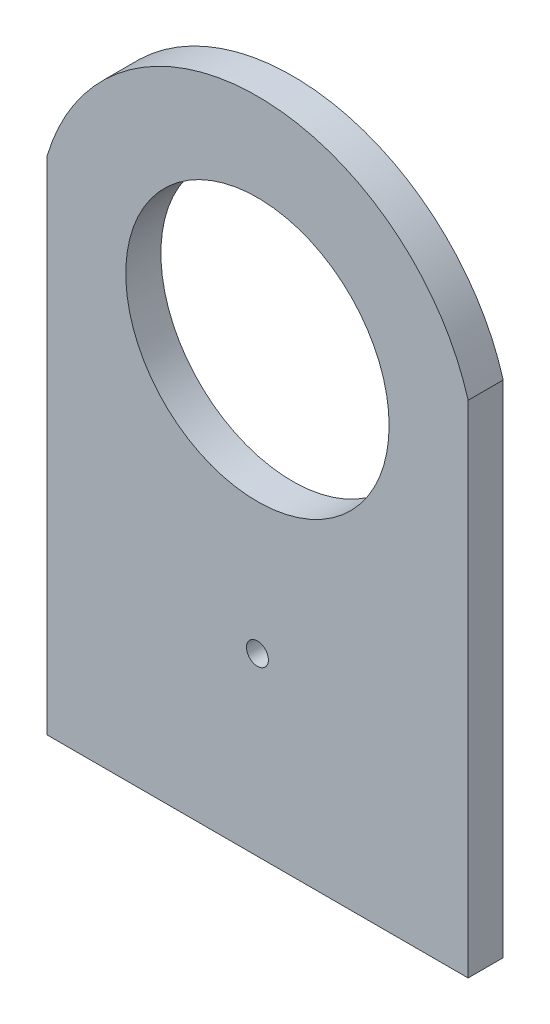
ISO-10303-21;
HEADER;
FILE_DESCRIPTION(('STEP AP214'),'2;1');
FILE_NAME('part.step','',(''),(''),'','','');
FILE_SCHEMA(('AUTOMOTIVE_DESIGN { 1 0 10303 214 1 1 1 1 }'));
ENDSEC;
DATA;
#1=APPLICATION_CONTEXT('core data for automotive mechanical design processes');
#2=APPLICATION_PROTOCOL_DEFINITION('international standard','automotive_design',2000,#1);
#3=PRODUCT_CONTEXT('',#1,'mechanical');
#4=PRODUCT('Part','Part','',(#3));
#5=PRODUCT_RELATED_PRODUCT_CATEGORY('part','',(#4));
#6=PRODUCT_DEFINITION_FORMATION('','',#4);
#7=PRODUCT_DEFINITION_CONTEXT('part definition',#1,'design');
#8=PRODUCT_DEFINITION('design','',#6,#7);
#9=PRODUCT_DEFINITION_SHAPE('','',#8);
#10=(LENGTH_UNIT() NAMED_UNIT(*) SI_UNIT(.MILLI.,.METRE.));
#11=(NAMED_UNIT(*) PLANE_ANGLE_UNIT() SI_UNIT($,.RADIAN.));
#12=(NAMED_UNIT(*) SI_UNIT($,.STERADIAN.) SOLID_ANGLE_UNIT());
#13=UNCERTAINTY_MEASURE_WITH_UNIT(LENGTH_MEASURE(1.E-05),#10,'distance_accuracy_value','');
#14=(GEOMETRIC_REPRESENTATION_CONTEXT(3) GLOBAL_UNCERTAINTY_ASSIGNED_CONTEXT((#13)) GLOBAL_UNIT_ASSIGNED_CONTEXT((#10,
#11,#12)) REPRESENTATION_CONTEXT('',''));
#15=CARTESIAN_POINT('',(0.,0.,0.));
#16=DIRECTION('',(0.,0.,1.));
#17=DIRECTION('',(1.,0.,0.));
#18=AXIS2_PLACEMENT_3D('',#15,#16,#17);
#19=CARTESIAN_POINT('',(0.,100.,8.));
#20=DIRECTION('',(0.,0.,1.));
#21=DIRECTION('',(1.,0.,0.));
#22=AXIS2_PLACEMENT_3D('',#19,#20,#21);
#23=PLANE('',#22);
#24=CARTESIAN_POINT('',(0.,40.,8.));
#25=DIRECTION('',(0.,0.,1.));
#26=DIRECTION('',(1.,0.,0.));
#27=AXIS2_PLACEMENT_3D('',#24,#25,#26);
#28=CIRCLE('',#27,2.5);
#29=CARTESIAN_POINT('',(2.5,40.,8.));
#30=VERTEX_POINT('',#29);
#31=EDGE_CURVE('E133',#30,#30,#28,.T.);
#32=ORIENTED_EDGE('',*,*,#31,.F.);
#33=EDGE_LOOP('',(#32));
#34=FACE_BOUND('',#33,.T.);
#35=DIRECTION('',(0.,1.,0.));
#36=VECTOR('',#35,1.);
#37=CARTESIAN_POINT('',(48.,114.,8.));
#38=LINE('',#37,#36);
#39=CARTESIAN_POINT('',(48.,0.,8.));
#40=VERTEX_POINT('',#39);
#41=CARTESIAN_POINT('',(48.,114.,8.));
#42=VERTEX_POINT('',#41);
#43=EDGE_CURVE('E88',#40,#42,#38,.T.);
#44=ORIENTED_EDGE('',*,*,#43,.T.);
#45=CARTESIAN_POINT('',(0.,100.,8.));
#46=DIRECTION('',(0.,0.,1.));
#47=DIRECTION('',(1.,0.,0.));
#48=AXIS2_PLACEMENT_3D('',#45,#46,#47);
#49=CIRCLE('',#48,50.);
#50=CARTESIAN_POINT('',(-48.,114.,8.));
#51=VERTEX_POINT('',#50);
#52=EDGE_CURVE('E83',#42,#51,#49,.T.);
#53=ORIENTED_EDGE('',*,*,#52,.T.);
#54=DIRECTION('',(0.,-1.,0.));
#55=VECTOR('',#54,1.);
#56=CARTESIAN_POINT('',(-48.,114.,8.));
#57=LINE('',#56,#55);
#58=CARTESIAN_POINT('',(-48.,0.,8.));
#59=VERTEX_POINT('',#58);
#60=EDGE_CURVE('E86',#51,#59,#57,.T.);
#61=ORIENTED_EDGE('',*,*,#60,.T.);
#62=DIRECTION('',(1.,0.,0.));
#63=VECTOR('',#62,1.);
#64=CARTESIAN_POINT('',(-48.,0.,8.));
#65=LINE('',#64,#63);
#66=EDGE_CURVE('E53',#59,#40,#65,.T.);
#67=ORIENTED_EDGE('',*,*,#66,.T.);
#68=EDGE_LOOP('',(#44,#53,#61,#67));
#69=FACE_BOUND('',#68,.T.);
#70=CARTESIAN_POINT('',(0.,100.,8.));
#71=DIRECTION('',(0.,0.,1.));
#72=DIRECTION('',(1.,0.,0.));
#73=AXIS2_PLACEMENT_3D('',#70,#71,#72);
#74=CIRCLE('',#73,30.);
#75=CARTESIAN_POINT('',(30.,100.,8.));
#76=VERTEX_POINT('',#75);
#77=EDGE_CURVE('E104',#76,#76,#74,.T.);
#78=ORIENTED_EDGE('',*,*,#77,.F.);
#79=EDGE_LOOP('',(#78));
#80=FACE_BOUND('',#79,.T.);
#81=ADVANCED_FACE('F35',(#34,#69,#80),#23,.T.);
#82=CARTESIAN_POINT('',(0.,100.,0.));
#83=DIRECTION('',(0.,0.,1.));
#84=DIRECTION('',(1.,0.,0.));
#85=AXIS2_PLACEMENT_3D('',#82,#83,#84);
#86=PLANE('',#85);
#87=CARTESIAN_POINT('',(0.,40.,0.));
#88=DIRECTION('',(0.,0.,1.));
#89=DIRECTION('',(1.,0.,0.));
#90=AXIS2_PLACEMENT_3D('',#87,#88,#89);
#91=CIRCLE('',#90,2.5);
#92=CARTESIAN_POINT('',(2.5,40.,0.));
#93=VERTEX_POINT('',#92);
#94=EDGE_CURVE('E39',#93,#93,#91,.T.);
#95=ORIENTED_EDGE('',*,*,#94,.T.);
#96=EDGE_LOOP('',(#95));
#97=FACE_BOUND('',#96,.T.);
#98=DIRECTION('',(0.,1.,0.));
#99=VECTOR('',#98,1.);
#100=CARTESIAN_POINT('',(48.,114.,0.));
#101=LINE('',#100,#99);
#102=CARTESIAN_POINT('',(48.,0.,0.));
#103=VERTEX_POINT('',#102);
#104=CARTESIAN_POINT('',(48.,114.,0.));
#105=VERTEX_POINT('',#104);
#106=EDGE_CURVE('E101',#103,#105,#101,.T.);
#107=ORIENTED_EDGE('',*,*,#106,.F.);
#108=DIRECTION('',(1.,0.,0.));
#109=VECTOR('',#108,1.);
#110=CARTESIAN_POINT('',(-48.,0.,0.));
#111=LINE('',#110,#109);
#112=CARTESIAN_POINT('',(-48.,0.,0.));
#113=VERTEX_POINT('',#112);
#114=EDGE_CURVE('E76',#113,#103,#111,.T.);
#115=ORIENTED_EDGE('',*,*,#114,.F.);
#116=DIRECTION('',(0.,-1.,0.));
#117=VECTOR('',#116,1.);
#118=CARTESIAN_POINT('',(-48.,114.,0.));
#119=LINE('',#118,#117);
#120=CARTESIAN_POINT('',(-48.,114.,0.));
#121=VERTEX_POINT('',#120);
#122=EDGE_CURVE('E70',#121,#113,#119,.T.);
#123=ORIENTED_EDGE('',*,*,#122,.F.);
#124=CARTESIAN_POINT('',(0.,100.,0.));
#125=DIRECTION('',(0.,0.,1.));
#126=DIRECTION('',(1.,0.,0.));
#127=AXIS2_PLACEMENT_3D('',#124,#125,#126);
#128=CIRCLE('',#127,50.);
#129=EDGE_CURVE('E92',#105,#121,#128,.T.);
#130=ORIENTED_EDGE('',*,*,#129,.F.);
#131=EDGE_LOOP('',(#107,#115,#123,#130));
#132=FACE_BOUND('',#131,.T.);
#133=CARTESIAN_POINT('',(0.,100.,0.));
#134=DIRECTION('',(0.,0.,1.));
#135=DIRECTION('',(1.,0.,0.));
#136=AXIS2_PLACEMENT_3D('',#133,#134,#135);
#137=CIRCLE('',#136,30.);
#138=CARTESIAN_POINT('',(30.,100.,0.));
#139=VERTEX_POINT('',#138);
#140=EDGE_CURVE('E116',#139,#139,#137,.T.);
#141=ORIENTED_EDGE('',*,*,#140,.T.);
#142=EDGE_LOOP('',(#141));
#143=FACE_BOUND('',#142,.T.);
#144=ADVANCED_FACE('F112',(#97,#132,#143),#86,.F.);
#145=CARTESIAN_POINT('',(48.,114.,8.));
#146=DIRECTION('',(-1.,0.,0.));
#147=DIRECTION('',(0.,-1.,0.));
#148=AXIS2_PLACEMENT_3D('',#145,#146,#147);
#149=PLANE('',#148);
#150=ORIENTED_EDGE('',*,*,#106,.T.);
#151=DIRECTION('',(0.,0.,-1.));
#152=VECTOR('',#151,1.);
#153=CARTESIAN_POINT('',(48.,114.,8.));
#154=LINE('',#153,#152);
#155=EDGE_CURVE('E11',#42,#105,#154,.T.);
#156=ORIENTED_EDGE('',*,*,#155,.F.);
#157=ORIENTED_EDGE('',*,*,#43,.F.);
#158=DIRECTION('',(0.,0.,-1.));
#159=VECTOR('',#158,1.);
#160=CARTESIAN_POINT('',(48.,0.,8.));
#161=LINE('',#160,#159);
#162=EDGE_CURVE('E97',#40,#103,#161,.T.);
#163=ORIENTED_EDGE('',*,*,#162,.T.);
#164=EDGE_LOOP('',(#150,#156,#157,#163));
#165=FACE_BOUND('',#164,.T.);
#166=ADVANCED_FACE('F37',(#165),#149,.F.);
#167=CARTESIAN_POINT('',(0.,100.,8.));
#168=DIRECTION('',(0.,0.,-1.));
#169=DIRECTION('',(-1.,0.,0.));
#170=AXIS2_PLACEMENT_3D('',#167,#168,#169);
#171=CYLINDRICAL_SURFACE('',#170,50.);
#172=ORIENTED_EDGE('',*,*,#129,.T.);
#173=DIRECTION('',(0.,0.,-1.));
#174=VECTOR('',#173,1.);
#175=CARTESIAN_POINT('',(-48.,114.,8.));
#176=LINE('',#175,#174);
#177=EDGE_CURVE('E45',#51,#121,#176,.T.);
#178=ORIENTED_EDGE('',*,*,#177,.F.);
#179=ORIENTED_EDGE('',*,*,#52,.F.);
#180=ORIENTED_EDGE('',*,*,#155,.T.);
#181=EDGE_LOOP('',(#172,#178,#179,#180));
#182=FACE_BOUND('',#181,.T.);
#183=ADVANCED_FACE('F91',(#182),#171,.T.);
#184=CARTESIAN_POINT('',(-48.,114.,8.));
#185=DIRECTION('',(1.,0.,0.));
#186=DIRECTION('',(0.,1.,0.));
#187=AXIS2_PLACEMENT_3D('',#184,#185,#186);
#188=PLANE('',#187);
#189=ORIENTED_EDGE('',*,*,#122,.T.);
#190=DIRECTION('',(0.,0.,-1.));
#191=VECTOR('',#190,1.);
#192=CARTESIAN_POINT('',(-48.,0.,8.));
#193=LINE('',#192,#191);
#194=EDGE_CURVE('E93',#59,#113,#193,.T.);
#195=ORIENTED_EDGE('',*,*,#194,.F.);
#196=ORIENTED_EDGE('',*,*,#60,.F.);
#197=ORIENTED_EDGE('',*,*,#177,.T.);
#198=EDGE_LOOP('',(#189,#195,#196,#197));
#199=FACE_BOUND('',#198,.T.);
#200=ADVANCED_FACE('F95',(#199),#188,.F.);
#201=CARTESIAN_POINT('',(-48.,0.,8.));
#202=DIRECTION('',(0.,1.,0.));
#203=DIRECTION('',(0.,0.,1.));
#204=AXIS2_PLACEMENT_3D('',#201,#202,#203);
#205=PLANE('',#204);
#206=CARTESIAN_POINT('',(35.,0.,4.00000000000001));
#207=DIRECTION('',(0.,-1.,0.));
#208=DIRECTION('',(0.,0.,-1.));
#209=AXIS2_PLACEMENT_3D('',#206,#207,#208);
#210=CIRCLE('',#209,2.5);
#211=CARTESIAN_POINT('',(35.,0.,1.50000000000001));
#212=VERTEX_POINT('',#211);
#213=EDGE_CURVE('E128',#212,#212,#210,.T.);
#214=ORIENTED_EDGE('',*,*,#213,.F.);
#215=EDGE_LOOP('',(#214));
#216=FACE_BOUND('',#215,.T.);
#217=CARTESIAN_POINT('',(-35.,0.,4.));
#218=DIRECTION('',(0.,-1.,0.));
#219=DIRECTION('',(0.,0.,-1.));
#220=AXIS2_PLACEMENT_3D('',#217,#218,#219);
#221=CIRCLE('',#220,2.5);
#222=CARTESIAN_POINT('',(-35.,0.,1.5));
#223=VERTEX_POINT('',#222);
#224=EDGE_CURVE('E122',#223,#223,#221,.T.);
#225=ORIENTED_EDGE('',*,*,#224,.F.);
#226=EDGE_LOOP('',(#225));
#227=FACE_BOUND('',#226,.T.);
#228=ORIENTED_EDGE('',*,*,#114,.T.);
#229=ORIENTED_EDGE('',*,*,#162,.F.);
#230=ORIENTED_EDGE('',*,*,#66,.F.);
#231=ORIENTED_EDGE('',*,*,#194,.T.);
#232=EDGE_LOOP('',(#228,#229,#230,#231));
#233=FACE_BOUND('',#232,.T.);
#234=ADVANCED_FACE('F109',(#216,#227,#233),#205,.F.);
#235=CARTESIAN_POINT('',(0.,100.,8.));
#236=DIRECTION('',(0.,0.,-1.));
#237=DIRECTION('',(-1.,0.,0.));
#238=AXIS2_PLACEMENT_3D('',#235,#236,#237);
#239=CYLINDRICAL_SURFACE('',#238,30.);
#240=ORIENTED_EDGE('',*,*,#77,.T.);
#241=EDGE_LOOP('',(#240));
#242=FACE_BOUND('',#241,.T.);
#243=ORIENTED_EDGE('',*,*,#140,.F.);
#244=EDGE_LOOP('',(#243));
#245=FACE_BOUND('',#244,.T.);
#246=ADVANCED_FACE('F160',(#242,#245),#239,.F.);
#247=CARTESIAN_POINT('',(-35.,50.,4.));
#248=DIRECTION('',(0.,-1.,0.));
#249=DIRECTION('',(0.,0.,-1.));
#250=AXIS2_PLACEMENT_3D('',#247,#248,#249);
#251=CYLINDRICAL_SURFACE('',#250,2.5);
#252=CARTESIAN_POINT('',(-35.,50.,4.));
#253=DIRECTION('',(0.,-1.,0.));
#254=DIRECTION('',(0.,0.,-1.));
#255=AXIS2_PLACEMENT_3D('',#252,#253,#254);
#256=CIRCLE('',#255,2.5);
#257=CARTESIAN_POINT('',(-35.,50.,1.5));
#258=VERTEX_POINT('',#257);
#259=EDGE_CURVE('E125',#258,#258,#256,.T.);
#260=ORIENTED_EDGE('',*,*,#259,.F.);
#261=EDGE_LOOP('',(#260));
#262=FACE_BOUND('',#261,.T.);
#263=ORIENTED_EDGE('',*,*,#224,.T.);
#264=EDGE_LOOP('',(#263));
#265=FACE_BOUND('',#264,.T.);
#266=ADVANCED_FACE('F208',(#262,#265),#251,.F.);
#267=CARTESIAN_POINT('',(-35.,50.,4.));
#268=DIRECTION('',(0.,-1.,0.));
#269=DIRECTION('',(0.,0.,-1.));
#270=AXIS2_PLACEMENT_3D('',#267,#268,#269);
#271=PLANE('',#270);
#272=ORIENTED_EDGE('',*,*,#259,.T.);
#273=EDGE_LOOP('',(#272));
#274=FACE_BOUND('',#273,.T.);
#275=ADVANCED_FACE('F199',(#274),#271,.T.);
#276=CARTESIAN_POINT('',(35.,50.,4.00000000000001));
#277=DIRECTION('',(0.,-1.,0.));
#278=DIRECTION('',(0.,0.,-1.));
#279=AXIS2_PLACEMENT_3D('',#276,#277,#278);
#280=CYLINDRICAL_SURFACE('',#279,2.5);
#281=CARTESIAN_POINT('',(35.,50.,4.00000000000001));
#282=DIRECTION('',(0.,-1.,0.));
#283=DIRECTION('',(0.,0.,-1.));
#284=AXIS2_PLACEMENT_3D('',#281,#282,#283);
#285=CIRCLE('',#284,2.5);
#286=CARTESIAN_POINT('',(35.,50.,1.50000000000001));
#287=VERTEX_POINT('',#286);
#288=EDGE_CURVE('E119',#287,#287,#285,.T.);
#289=ORIENTED_EDGE('',*,*,#288,.F.);
#290=EDGE_LOOP('',(#289));
#291=FACE_BOUND('',#290,.T.);
#292=ORIENTED_EDGE('',*,*,#213,.T.);
#293=EDGE_LOOP('',(#292));
#294=FACE_BOUND('',#293,.T.);
#295=ADVANCED_FACE('F148',(#291,#294),#280,.F.);
#296=CARTESIAN_POINT('',(35.,50.,4.00000000000001));
#297=DIRECTION('',(0.,-1.,0.));
#298=DIRECTION('',(0.,0.,-1.));
#299=AXIS2_PLACEMENT_3D('',#296,#297,#298);
#300=PLANE('',#299);
#301=ORIENTED_EDGE('',*,*,#288,.T.);
#302=EDGE_LOOP('',(#301));
#303=FACE_BOUND('',#302,.T.);
#304=ADVANCED_FACE('F143',(#303),#300,.T.);
#305=CARTESIAN_POINT('',(0.,40.,-12.));
#306=DIRECTION('',(0.,0.,1.));
#307=DIRECTION('',(1.,0.,0.));
#308=AXIS2_PLACEMENT_3D('',#305,#306,#307);
#309=CYLINDRICAL_SURFACE('',#308,2.5);
#310=ORIENTED_EDGE('',*,*,#31,.T.);
#311=EDGE_LOOP('',(#310));
#312=FACE_BOUND('',#311,.T.);
#313=ORIENTED_EDGE('',*,*,#94,.F.);
#314=EDGE_LOOP('',(#313));
#315=FACE_BOUND('',#314,.T.);
#316=ADVANCED_FACE('F141',(#312,#315),#309,.F.);
#317=CLOSED_SHELL('',(#81,#144,#166,#183,#200,#234,#246,#266,#275,#295,#304,#316));
#318=MANIFOLD_SOLID_BREP('B2',#317);
#319=ADVANCED_BREP_SHAPE_REPRESENTATION('',(#18,#318),#14);
#320=SHAPE_DEFINITION_REPRESENTATION(#9,#319);
ENDSEC;
END-ISO-10303-21;
